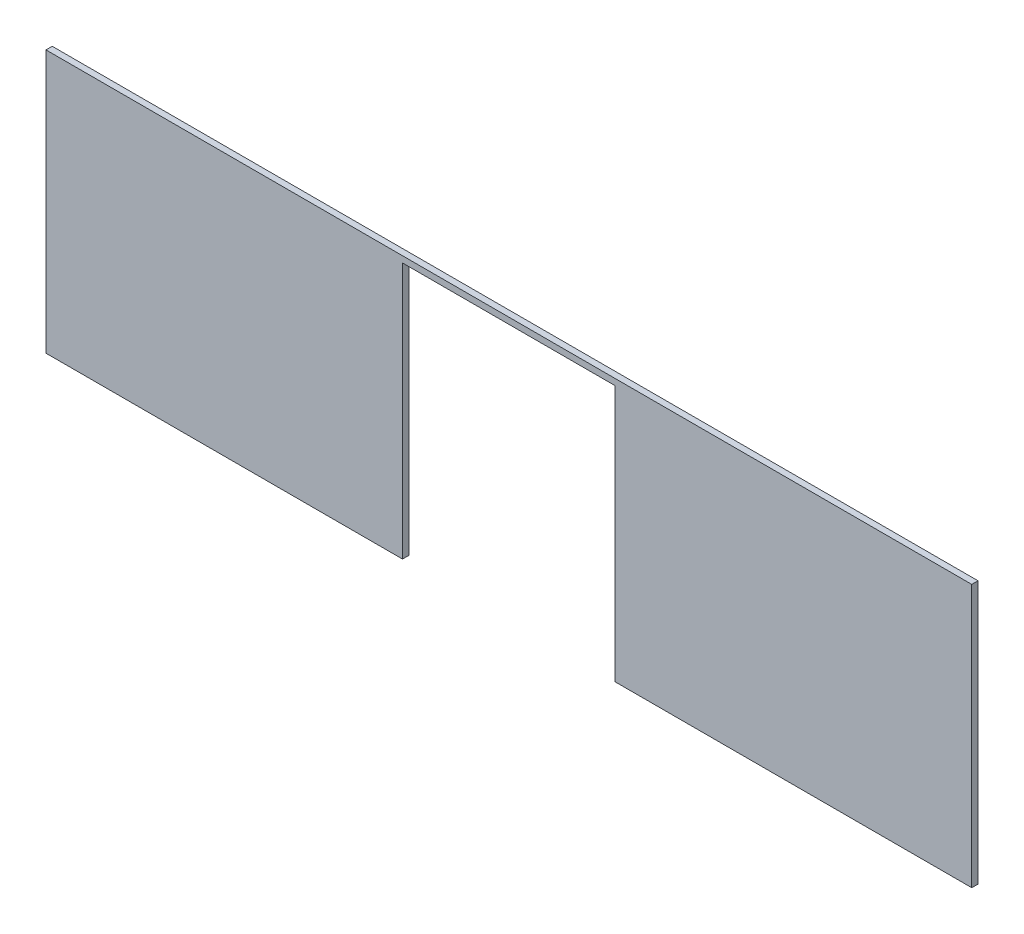
ISO-10303-21;
HEADER;
FILE_DESCRIPTION(('STEP AP214'),'2;1');
FILE_NAME('part.step','',(''),(''),'','','');
FILE_SCHEMA(('AUTOMOTIVE_DESIGN { 1 0 10303 214 1 1 1 1 }'));
ENDSEC;
DATA;
#1=APPLICATION_CONTEXT('core data for automotive mechanical design processes');
#2=APPLICATION_PROTOCOL_DEFINITION('international standard','automotive_design',2000,#1);
#3=PRODUCT_CONTEXT('',#1,'mechanical');
#4=PRODUCT('Part','Part','',(#3));
#5=PRODUCT_RELATED_PRODUCT_CATEGORY('part','',(#4));
#6=PRODUCT_DEFINITION_FORMATION('','',#4);
#7=PRODUCT_DEFINITION_CONTEXT('part definition',#1,'design');
#8=PRODUCT_DEFINITION('design','',#6,#7);
#9=PRODUCT_DEFINITION_SHAPE('','',#8);
#10=(LENGTH_UNIT() NAMED_UNIT(*) SI_UNIT(.MILLI.,.METRE.));
#11=(NAMED_UNIT(*) PLANE_ANGLE_UNIT() SI_UNIT($,.RADIAN.));
#12=(NAMED_UNIT(*) SI_UNIT($,.STERADIAN.) SOLID_ANGLE_UNIT());
#13=UNCERTAINTY_MEASURE_WITH_UNIT(LENGTH_MEASURE(1.E-05),#10,'distance_accuracy_value','');
#14=(GEOMETRIC_REPRESENTATION_CONTEXT(3) GLOBAL_UNCERTAINTY_ASSIGNED_CONTEXT((#13)) GLOBAL_UNIT_ASSIGNED_CONTEXT((#10,
#11,#12)) REPRESENTATION_CONTEXT('',''));
#15=CARTESIAN_POINT('',(0.,0.,0.));
#16=DIRECTION('',(0.,0.,1.));
#17=DIRECTION('',(1.,0.,0.));
#18=AXIS2_PLACEMENT_3D('',#15,#16,#17);
#19=CARTESIAN_POINT('',(-234.95,-66.675,3.175));
#20=DIRECTION('',(0.,1.,0.));
#21=DIRECTION('',(0.,0.,1.));
#22=AXIS2_PLACEMENT_3D('',#19,#20,#21);
#23=PLANE('',#22);
#24=DIRECTION('',(0.,0.,1.));
#25=VECTOR('',#24,1.);
#26=CARTESIAN_POINT('',(-53.975,-66.675,0.));
#27=LINE('',#26,#25);
#28=CARTESIAN_POINT('',(-53.975,-66.675,0.));
#29=VERTEX_POINT('',#28);
#30=CARTESIAN_POINT('',(-53.975,-66.675,3.175));
#31=VERTEX_POINT('',#30);
#32=EDGE_CURVE('E137',#29,#31,#27,.T.);
#33=ORIENTED_EDGE('',*,*,#32,.T.);
#34=DIRECTION('',(1.,0.,0.));
#35=VECTOR('',#34,1.);
#36=CARTESIAN_POINT('',(-234.95,-66.675,3.175));
#37=LINE('',#36,#35);
#38=CARTESIAN_POINT('',(-234.95,-66.675,3.175));
#39=VERTEX_POINT('',#38);
#40=EDGE_CURVE('E147',#39,#31,#37,.T.);
#41=ORIENTED_EDGE('',*,*,#40,.F.);
#42=DIRECTION('',(0.,0.,-1.));
#43=VECTOR('',#42,1.);
#44=CARTESIAN_POINT('',(-234.95,-66.675,3.175));
#45=LINE('',#44,#43);
#46=CARTESIAN_POINT('',(-234.95,-66.675,0.));
#47=VERTEX_POINT('',#46);
#48=EDGE_CURVE('E160',#39,#47,#45,.T.);
#49=ORIENTED_EDGE('',*,*,#48,.T.);
#50=DIRECTION('',(1.,0.,0.));
#51=VECTOR('',#50,1.);
#52=CARTESIAN_POINT('',(-234.95,-66.675,0.));
#53=LINE('',#52,#51);
#54=EDGE_CURVE('E143',#47,#29,#53,.T.);
#55=ORIENTED_EDGE('',*,*,#54,.T.);
#56=EDGE_LOOP('',(#33,#41,#49,#55));
#57=FACE_BOUND('',#56,.T.);
#58=ADVANCED_FACE('F34',(#57),#23,.F.);
#59=CARTESIAN_POINT('',(234.95,-66.675,3.175));
#60=DIRECTION('',(-1.,0.,0.));
#61=DIRECTION('',(0.,0.,1.));
#62=AXIS2_PLACEMENT_3D('',#59,#60,#61);
#63=PLANE('',#62);
#64=DIRECTION('',(0.,1.,0.));
#65=VECTOR('',#64,1.);
#66=CARTESIAN_POINT('',(234.95,-66.675,0.));
#67=LINE('',#66,#65);
#68=CARTESIAN_POINT('',(234.95,-66.675,0.));
#69=VERTEX_POINT('',#68);
#70=CARTESIAN_POINT('',(234.95,66.675,0.));
#71=VERTEX_POINT('',#70);
#72=EDGE_CURVE('E136',#69,#71,#67,.T.);
#73=ORIENTED_EDGE('',*,*,#72,.T.);
#74=DIRECTION('',(0.,0.,-1.));
#75=VECTOR('',#74,1.);
#76=CARTESIAN_POINT('',(234.95,66.675,3.175));
#77=LINE('',#76,#75);
#78=CARTESIAN_POINT('',(234.95,66.675,3.175));
#79=VERTEX_POINT('',#78);
#80=EDGE_CURVE('E11',#79,#71,#77,.T.);
#81=ORIENTED_EDGE('',*,*,#80,.F.);
#82=DIRECTION('',(0.,1.,0.));
#83=VECTOR('',#82,1.);
#84=CARTESIAN_POINT('',(234.95,-66.675,3.175));
#85=LINE('',#84,#83);
#86=CARTESIAN_POINT('',(234.95,-66.675,3.175));
#87=VERTEX_POINT('',#86);
#88=EDGE_CURVE('E141',#87,#79,#85,.T.);
#89=ORIENTED_EDGE('',*,*,#88,.F.);
#90=DIRECTION('',(0.,0.,-1.));
#91=VECTOR('',#90,1.);
#92=CARTESIAN_POINT('',(234.95,-66.675,3.175));
#93=LINE('',#92,#91);
#94=EDGE_CURVE('E150',#87,#69,#93,.T.);
#95=ORIENTED_EDGE('',*,*,#94,.T.);
#96=EDGE_LOOP('',(#73,#81,#89,#95));
#97=FACE_BOUND('',#96,.T.);
#98=ADVANCED_FACE('F36',(#97),#63,.F.);
#99=CARTESIAN_POINT('',(-234.95,66.675,3.175));
#100=DIRECTION('',(0.,-1.,0.));
#101=DIRECTION('',(0.,0.,-1.));
#102=AXIS2_PLACEMENT_3D('',#99,#100,#101);
#103=PLANE('',#102);
#104=DIRECTION('',(-1.,0.,0.));
#105=VECTOR('',#104,1.);
#106=CARTESIAN_POINT('',(-234.95,66.675,0.));
#107=LINE('',#106,#105);
#108=CARTESIAN_POINT('',(-234.95,66.675,0.));
#109=VERTEX_POINT('',#108);
#110=EDGE_CURVE('E153',#71,#109,#107,.T.);
#111=ORIENTED_EDGE('',*,*,#110,.T.);
#112=DIRECTION('',(0.,0.,-1.));
#113=VECTOR('',#112,1.);
#114=CARTESIAN_POINT('',(-234.95,66.675,3.175));
#115=LINE('',#114,#113);
#116=CARTESIAN_POINT('',(-234.95,66.675,3.175));
#117=VERTEX_POINT('',#116);
#118=EDGE_CURVE('E42',#117,#109,#115,.T.);
#119=ORIENTED_EDGE('',*,*,#118,.F.);
#120=DIRECTION('',(-1.,0.,0.));
#121=VECTOR('',#120,1.);
#122=CARTESIAN_POINT('',(-234.95,66.675,3.175));
#123=LINE('',#122,#121);
#124=EDGE_CURVE('E87',#79,#117,#123,.T.);
#125=ORIENTED_EDGE('',*,*,#124,.F.);
#126=ORIENTED_EDGE('',*,*,#80,.T.);
#127=EDGE_LOOP('',(#111,#119,#125,#126));
#128=FACE_BOUND('',#127,.T.);
#129=ADVANCED_FACE('F175',(#128),#103,.F.);
#130=CARTESIAN_POINT('',(-234.95,-66.675,3.175));
#131=DIRECTION('',(1.,0.,0.));
#132=DIRECTION('',(0.,0.,-1.));
#133=AXIS2_PLACEMENT_3D('',#130,#131,#132);
#134=PLANE('',#133);
#135=DIRECTION('',(0.,-1.,0.));
#136=VECTOR('',#135,1.);
#137=CARTESIAN_POINT('',(-234.95,-66.675,0.));
#138=LINE('',#137,#136);
#139=EDGE_CURVE('E155',#109,#47,#138,.T.);
#140=ORIENTED_EDGE('',*,*,#139,.T.);
#141=ORIENTED_EDGE('',*,*,#48,.F.);
#142=DIRECTION('',(0.,-1.,0.));
#143=VECTOR('',#142,1.);
#144=CARTESIAN_POINT('',(-234.95,-66.675,3.175));
#145=LINE('',#144,#143);
#146=EDGE_CURVE('E145',#117,#39,#145,.T.);
#147=ORIENTED_EDGE('',*,*,#146,.F.);
#148=ORIENTED_EDGE('',*,*,#118,.T.);
#149=EDGE_LOOP('',(#140,#141,#147,#148));
#150=FACE_BOUND('',#149,.T.);
#151=ADVANCED_FACE('F166',(#150),#134,.F.);
#152=CARTESIAN_POINT('',(53.975,-66.675,3.175));
#153=VERTEX_POINT('',#152);
#154=EDGE_CURVE('E58',#153,#87,#37,.T.);
#155=ORIENTED_EDGE('',*,*,#154,.F.);
#156=DIRECTION('',(0.,0.,1.));
#157=VECTOR('',#156,1.);
#158=CARTESIAN_POINT('',(53.975,-66.675,0.));
#159=LINE('',#158,#157);
#160=CARTESIAN_POINT('',(53.975,-66.675,0.));
#161=VERTEX_POINT('',#160);
#162=EDGE_CURVE('E134',#161,#153,#159,.T.);
#163=ORIENTED_EDGE('',*,*,#162,.F.);
#164=EDGE_CURVE('E80',#161,#69,#53,.T.);
#165=ORIENTED_EDGE('',*,*,#164,.T.);
#166=ORIENTED_EDGE('',*,*,#94,.F.);
#167=EDGE_LOOP('',(#155,#163,#165,#166));
#168=FACE_BOUND('',#167,.T.);
#169=ADVANCED_FACE('F181',(#168),#23,.F.);
#170=CARTESIAN_POINT('',(0.,0.,3.175));
#171=DIRECTION('',(0.,0.,-1.));
#172=DIRECTION('',(-1.,0.,0.));
#173=AXIS2_PLACEMENT_3D('',#170,#171,#172);
#174=PLANE('',#173);
#175=DIRECTION('',(-1.,0.,0.));
#176=VECTOR('',#175,1.);
#177=CARTESIAN_POINT('',(53.975,63.5,3.175));
#178=LINE('',#177,#176);
#179=CARTESIAN_POINT('',(53.975,63.5,3.175));
#180=VERTEX_POINT('',#179);
#181=CARTESIAN_POINT('',(-53.975,63.5,3.175));
#182=VERTEX_POINT('',#181);
#183=EDGE_CURVE('E128',#180,#182,#178,.T.);
#184=ORIENTED_EDGE('',*,*,#183,.F.);
#185=DIRECTION('',(0.,1.,0.));
#186=VECTOR('',#185,1.);
#187=CARTESIAN_POINT('',(53.975,-66.675,3.175));
#188=LINE('',#187,#186);
#189=EDGE_CURVE('E113',#153,#180,#188,.T.);
#190=ORIENTED_EDGE('',*,*,#189,.F.);
#191=ORIENTED_EDGE('',*,*,#154,.T.);
#192=ORIENTED_EDGE('',*,*,#88,.T.);
#193=ORIENTED_EDGE('',*,*,#124,.T.);
#194=ORIENTED_EDGE('',*,*,#146,.T.);
#195=ORIENTED_EDGE('',*,*,#40,.T.);
#196=DIRECTION('',(0.,1.,0.));
#197=VECTOR('',#196,1.);
#198=CARTESIAN_POINT('',(-53.975,-66.675,3.175));
#199=LINE('',#198,#197);
#200=EDGE_CURVE('E125',#31,#182,#199,.T.);
#201=ORIENTED_EDGE('',*,*,#200,.T.);
#202=EDGE_LOOP('',(#184,#190,#191,#192,#193,#194,#195,#201));
#203=FACE_BOUND('',#202,.T.);
#204=ADVANCED_FACE('F171',(#203),#174,.F.);
#205=CARTESIAN_POINT('',(0.,0.,0.));
#206=DIRECTION('',(0.,0.,-1.));
#207=DIRECTION('',(-1.,0.,0.));
#208=AXIS2_PLACEMENT_3D('',#205,#206,#207);
#209=PLANE('',#208);
#210=DIRECTION('',(0.,1.,0.));
#211=VECTOR('',#210,1.);
#212=CARTESIAN_POINT('',(53.975,-66.675,0.));
#213=LINE('',#212,#211);
#214=CARTESIAN_POINT('',(53.975,63.5,0.));
#215=VERTEX_POINT('',#214);
#216=EDGE_CURVE('E112',#161,#215,#213,.T.);
#217=ORIENTED_EDGE('',*,*,#216,.T.);
#218=DIRECTION('',(-1.,0.,0.));
#219=VECTOR('',#218,1.);
#220=CARTESIAN_POINT('',(53.975,63.5,0.));
#221=LINE('',#220,#219);
#222=CARTESIAN_POINT('',(-53.975,63.5,0.));
#223=VERTEX_POINT('',#222);
#224=EDGE_CURVE('E118',#215,#223,#221,.T.);
#225=ORIENTED_EDGE('',*,*,#224,.T.);
#226=DIRECTION('',(0.,1.,0.));
#227=VECTOR('',#226,1.);
#228=CARTESIAN_POINT('',(-53.975,-66.675,0.));
#229=LINE('',#228,#227);
#230=EDGE_CURVE('E115',#29,#223,#229,.T.);
#231=ORIENTED_EDGE('',*,*,#230,.F.);
#232=ORIENTED_EDGE('',*,*,#54,.F.);
#233=ORIENTED_EDGE('',*,*,#139,.F.);
#234=ORIENTED_EDGE('',*,*,#110,.F.);
#235=ORIENTED_EDGE('',*,*,#72,.F.);
#236=ORIENTED_EDGE('',*,*,#164,.F.);
#237=EDGE_LOOP('',(#217,#225,#231,#232,#233,#234,#235,#236));
#238=FACE_BOUND('',#237,.T.);
#239=ADVANCED_FACE('F123',(#238),#209,.T.);
#240=CARTESIAN_POINT('',(53.975,-66.675,0.));
#241=DIRECTION('',(1.,0.,0.));
#242=DIRECTION('',(0.,0.,-1.));
#243=AXIS2_PLACEMENT_3D('',#240,#241,#242);
#244=PLANE('',#243);
#245=ORIENTED_EDGE('',*,*,#189,.T.);
#246=DIRECTION('',(0.,0.,1.));
#247=VECTOR('',#246,1.);
#248=CARTESIAN_POINT('',(53.975,63.5,0.));
#249=LINE('',#248,#247);
#250=EDGE_CURVE('E109',#215,#180,#249,.T.);
#251=ORIENTED_EDGE('',*,*,#250,.F.);
#252=ORIENTED_EDGE('',*,*,#216,.F.);
#253=ORIENTED_EDGE('',*,*,#162,.T.);
#254=EDGE_LOOP('',(#245,#251,#252,#253));
#255=FACE_BOUND('',#254,.T.);
#256=ADVANCED_FACE('F110',(#255),#244,.F.);
#257=CARTESIAN_POINT('',(-53.975,-66.675,0.));
#258=DIRECTION('',(1.,0.,0.));
#259=DIRECTION('',(0.,0.,-1.));
#260=AXIS2_PLACEMENT_3D('',#257,#258,#259);
#261=PLANE('',#260);
#262=ORIENTED_EDGE('',*,*,#200,.F.);
#263=ORIENTED_EDGE('',*,*,#32,.F.);
#264=ORIENTED_EDGE('',*,*,#230,.T.);
#265=DIRECTION('',(0.,0.,1.));
#266=VECTOR('',#265,1.);
#267=CARTESIAN_POINT('',(-53.975,63.5,0.));
#268=LINE('',#267,#266);
#269=EDGE_CURVE('E49',#223,#182,#268,.T.);
#270=ORIENTED_EDGE('',*,*,#269,.T.);
#271=EDGE_LOOP('',(#262,#263,#264,#270));
#272=FACE_BOUND('',#271,.T.);
#273=ADVANCED_FACE('F199',(#272),#261,.T.);
#274=CARTESIAN_POINT('',(53.975,63.5,0.));
#275=DIRECTION('',(0.,1.,0.));
#276=DIRECTION('',(0.,0.,1.));
#277=AXIS2_PLACEMENT_3D('',#274,#275,#276);
#278=PLANE('',#277);
#279=ORIENTED_EDGE('',*,*,#183,.T.);
#280=ORIENTED_EDGE('',*,*,#269,.F.);
#281=ORIENTED_EDGE('',*,*,#224,.F.);
#282=ORIENTED_EDGE('',*,*,#250,.T.);
#283=EDGE_LOOP('',(#279,#280,#281,#282));
#284=FACE_BOUND('',#283,.T.);
#285=ADVANCED_FACE('F119',(#284),#278,.F.);
#286=CLOSED_SHELL('',(#58,#98,#129,#151,#169,#204,#239,#256,#273,#285));
#287=MANIFOLD_SOLID_BREP('B2',#286);
#288=ADVANCED_BREP_SHAPE_REPRESENTATION('',(#18,#287),#14);
#289=SHAPE_DEFINITION_REPRESENTATION(#9,#288);
ENDSEC;
END-ISO-10303-21;
